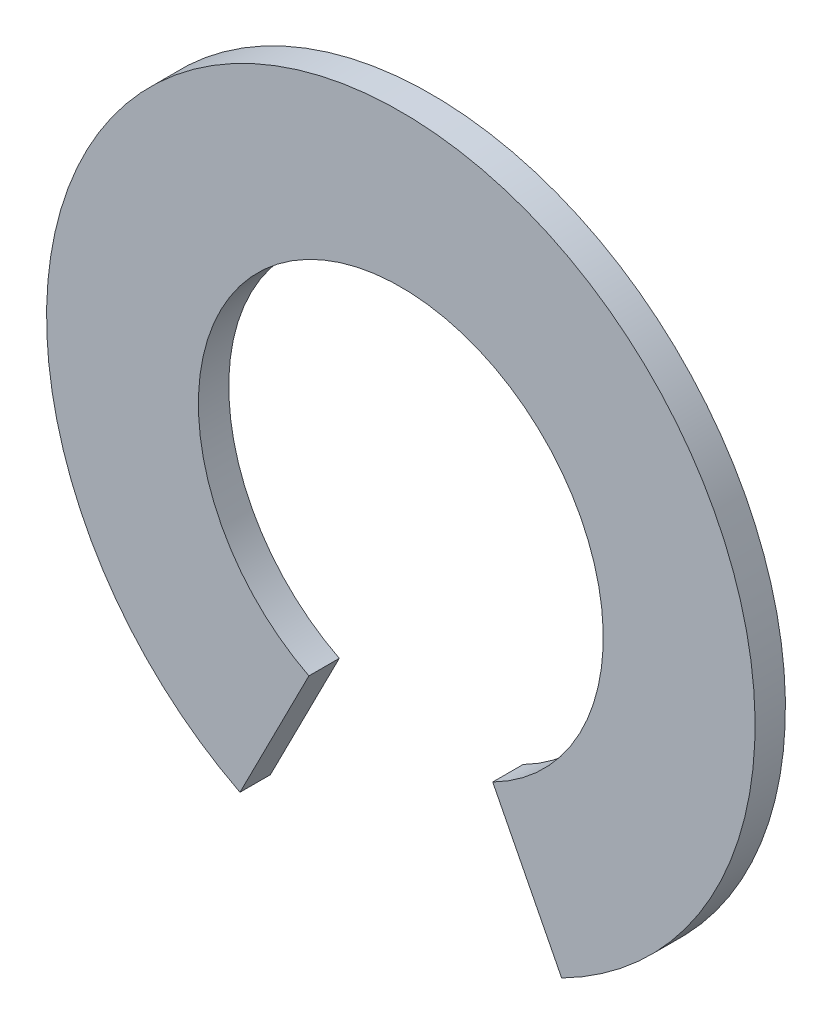
ISO-10303-21;
HEADER;
FILE_DESCRIPTION(('STEP AP214'),'2;1');
FILE_NAME('part.step','',(''),(''),'','','');
FILE_SCHEMA(('AUTOMOTIVE_DESIGN { 1 0 10303 214 1 1 1 1 }'));
ENDSEC;
DATA;
#1=APPLICATION_CONTEXT('core data for automotive mechanical design processes');
#2=APPLICATION_PROTOCOL_DEFINITION('international standard','automotive_design',2000,#1);
#3=PRODUCT_CONTEXT('',#1,'mechanical');
#4=PRODUCT('Part','Part','',(#3));
#5=PRODUCT_RELATED_PRODUCT_CATEGORY('part','',(#4));
#6=PRODUCT_DEFINITION_FORMATION('','',#4);
#7=PRODUCT_DEFINITION_CONTEXT('part definition',#1,'design');
#8=PRODUCT_DEFINITION('design','',#6,#7);
#9=PRODUCT_DEFINITION_SHAPE('','',#8);
#10=(LENGTH_UNIT() NAMED_UNIT(*) SI_UNIT(.MILLI.,.METRE.));
#11=(NAMED_UNIT(*) PLANE_ANGLE_UNIT() SI_UNIT($,.RADIAN.));
#12=(NAMED_UNIT(*) SI_UNIT($,.STERADIAN.) SOLID_ANGLE_UNIT());
#13=UNCERTAINTY_MEASURE_WITH_UNIT(LENGTH_MEASURE(1.E-05),#10,'distance_accuracy_value','');
#14=(GEOMETRIC_REPRESENTATION_CONTEXT(3) GLOBAL_UNCERTAINTY_ASSIGNED_CONTEXT((#13)) GLOBAL_UNIT_ASSIGNED_CONTEXT((#10,
#11,#12)) REPRESENTATION_CONTEXT('',''));
#15=CARTESIAN_POINT('',(0.,0.,0.));
#16=DIRECTION('',(0.,0.,1.));
#17=DIRECTION('',(1.,0.,0.));
#18=AXIS2_PLACEMENT_3D('',#15,#16,#17);
#19=CARTESIAN_POINT('',(0.,0.,1.5));
#20=DIRECTION('',(0.,0.,-1.));
#21=DIRECTION('',(-1.,0.,0.));
#22=AXIS2_PLACEMENT_3D('',#19,#20,#21);
#23=CYLINDRICAL_SURFACE('',#22,10.);
#24=CARTESIAN_POINT('',(0.,0.,0.));
#25=DIRECTION('',(0.,0.,-1.));
#26=DIRECTION('',(1.,0.,0.));
#27=AXIS2_PLACEMENT_3D('',#24,#25,#26);
#28=CIRCLE('',#27,10.);
#29=CARTESIAN_POINT('',(-4.53990499739548,-8.91006524188367,0.));
#30=VERTEX_POINT('',#29);
#31=CARTESIAN_POINT('',(4.53990499739548,-8.91006524188367,0.));
#32=VERTEX_POINT('',#31);
#33=EDGE_CURVE('E98',#30,#32,#28,.T.);
#34=ORIENTED_EDGE('',*,*,#33,.T.);
#35=DIRECTION('',(0.,0.,-1.));
#36=VECTOR('',#35,1.);
#37=CARTESIAN_POINT('',(4.53990499739548,-8.91006524188367,1.5));
#38=LINE('',#37,#36);
#39=CARTESIAN_POINT('',(4.53990499739548,-8.91006524188367,1.5));
#40=VERTEX_POINT('',#39);
#41=EDGE_CURVE('E11',#40,#32,#38,.T.);
#42=ORIENTED_EDGE('',*,*,#41,.F.);
#43=CARTESIAN_POINT('',(0.,0.,1.5));
#44=DIRECTION('',(0.,0.,-1.));
#45=DIRECTION('',(1.,0.,0.));
#46=AXIS2_PLACEMENT_3D('',#43,#44,#45);
#47=CIRCLE('',#46,10.);
#48=CARTESIAN_POINT('',(-4.53990499739548,-8.91006524188367,1.5));
#49=VERTEX_POINT('',#48);
#50=EDGE_CURVE('E86',#49,#40,#47,.T.);
#51=ORIENTED_EDGE('',*,*,#50,.F.);
#52=DIRECTION('',(0.,0.,-1.));
#53=VECTOR('',#52,1.);
#54=CARTESIAN_POINT('',(-4.53990499739548,-8.91006524188367,1.5));
#55=LINE('',#54,#53);
#56=EDGE_CURVE('E94',#49,#30,#55,.T.);
#57=ORIENTED_EDGE('',*,*,#56,.T.);
#58=EDGE_LOOP('',(#34,#42,#51,#57));
#59=FACE_BOUND('',#58,.T.);
#60=ADVANCED_FACE('F35',(#59),#23,.F.);
#61=CARTESIAN_POINT('',(4.53990499739548,-8.91006524188367,1.5));
#62=DIRECTION('',(0.891006524188367,0.453990499739547,0.));
#63=DIRECTION('',(-0.453990499739548,0.891006524188368,0.));
#64=AXIS2_PLACEMENT_3D('',#61,#62,#63);
#65=PLANE('',#64);
#66=DIRECTION('',(0.453990499739548,-0.891006524188368,0.));
#67=VECTOR('',#66,1.);
#68=CARTESIAN_POINT('',(4.53990499739548,-8.91006524188367,0.));
#69=LINE('',#68,#67);
#70=CARTESIAN_POINT('',(7.94483374544208,-15.5926141732964,0.));
#71=VERTEX_POINT('',#70);
#72=EDGE_CURVE('E90',#32,#71,#69,.T.);
#73=ORIENTED_EDGE('',*,*,#72,.T.);
#74=DIRECTION('',(0.,0.,-1.));
#75=VECTOR('',#74,1.);
#76=CARTESIAN_POINT('',(7.94483374544208,-15.5926141732964,1.5));
#77=LINE('',#76,#75);
#78=CARTESIAN_POINT('',(7.94483374544208,-15.5926141732964,1.5));
#79=VERTEX_POINT('',#78);
#80=EDGE_CURVE('E43',#79,#71,#77,.T.);
#81=ORIENTED_EDGE('',*,*,#80,.F.);
#82=DIRECTION('',(0.453990499739548,-0.891006524188368,0.));
#83=VECTOR('',#82,1.);
#84=CARTESIAN_POINT('',(4.53990499739548,-8.91006524188367,1.5));
#85=LINE('',#84,#83);
#86=EDGE_CURVE('E81',#40,#79,#85,.T.);
#87=ORIENTED_EDGE('',*,*,#86,.F.);
#88=ORIENTED_EDGE('',*,*,#41,.T.);
#89=EDGE_LOOP('',(#73,#81,#87,#88));
#90=FACE_BOUND('',#89,.T.);
#91=ADVANCED_FACE('F89',(#90),#65,.F.);
#92=CARTESIAN_POINT('',(0.,0.,1.5));
#93=DIRECTION('',(0.,0.,-1.));
#94=DIRECTION('',(-1.,0.,0.));
#95=AXIS2_PLACEMENT_3D('',#92,#93,#94);
#96=CYLINDRICAL_SURFACE('',#95,17.5);
#97=CARTESIAN_POINT('',(0.,0.,0.));
#98=DIRECTION('',(0.,0.,1.));
#99=DIRECTION('',(1.,0.,0.));
#100=AXIS2_PLACEMENT_3D('',#97,#98,#99);
#101=CIRCLE('',#100,17.5);
#102=CARTESIAN_POINT('',(-7.94483374544208,-15.5926141732964,0.));
#103=VERTEX_POINT('',#102);
#104=EDGE_CURVE('E68',#71,#103,#101,.T.);
#105=ORIENTED_EDGE('',*,*,#104,.T.);
#106=DIRECTION('',(0.,0.,-1.));
#107=VECTOR('',#106,1.);
#108=CARTESIAN_POINT('',(-7.94483374544208,-15.5926141732964,1.5));
#109=LINE('',#108,#107);
#110=CARTESIAN_POINT('',(-7.94483374544208,-15.5926141732964,1.5));
#111=VERTEX_POINT('',#110);
#112=EDGE_CURVE('E91',#111,#103,#109,.T.);
#113=ORIENTED_EDGE('',*,*,#112,.F.);
#114=CARTESIAN_POINT('',(0.,0.,1.5));
#115=DIRECTION('',(0.,0.,1.));
#116=DIRECTION('',(1.,0.,0.));
#117=AXIS2_PLACEMENT_3D('',#114,#115,#116);
#118=CIRCLE('',#117,17.5);
#119=EDGE_CURVE('E84',#79,#111,#118,.T.);
#120=ORIENTED_EDGE('',*,*,#119,.F.);
#121=ORIENTED_EDGE('',*,*,#80,.T.);
#122=EDGE_LOOP('',(#105,#113,#120,#121));
#123=FACE_BOUND('',#122,.T.);
#124=ADVANCED_FACE('F92',(#123),#96,.T.);
#125=CARTESIAN_POINT('',(-4.53990499739548,-8.91006524188367,1.5));
#126=DIRECTION('',(-0.891006524188367,0.453990499739548,0.));
#127=DIRECTION('',(-0.453990499739548,-0.891006524188367,0.));
#128=AXIS2_PLACEMENT_3D('',#125,#126,#127);
#129=PLANE('',#128);
#130=DIRECTION('',(0.453990499739548,0.891006524188367,0.));
#131=VECTOR('',#130,1.);
#132=CARTESIAN_POINT('',(-4.53990499739548,-8.91006524188367,0.));
#133=LINE('',#132,#131);
#134=EDGE_CURVE('E74',#103,#30,#133,.T.);
#135=ORIENTED_EDGE('',*,*,#134,.T.);
#136=ORIENTED_EDGE('',*,*,#56,.F.);
#137=DIRECTION('',(0.453990499739548,0.891006524188367,0.));
#138=VECTOR('',#137,1.);
#139=CARTESIAN_POINT('',(-4.53990499739548,-8.91006524188367,1.5));
#140=LINE('',#139,#138);
#141=EDGE_CURVE('E51',#111,#49,#140,.T.);
#142=ORIENTED_EDGE('',*,*,#141,.F.);
#143=ORIENTED_EDGE('',*,*,#112,.T.);
#144=EDGE_LOOP('',(#135,#136,#142,#143));
#145=FACE_BOUND('',#144,.T.);
#146=ADVANCED_FACE('F105',(#145),#129,.F.);
#147=CARTESIAN_POINT('',(0.,0.,1.5));
#148=DIRECTION('',(0.,0.,1.));
#149=DIRECTION('',(1.,0.,0.));
#150=AXIS2_PLACEMENT_3D('',#147,#148,#149);
#151=PLANE('',#150);
#152=ORIENTED_EDGE('',*,*,#50,.T.);
#153=ORIENTED_EDGE('',*,*,#86,.T.);
#154=ORIENTED_EDGE('',*,*,#119,.T.);
#155=ORIENTED_EDGE('',*,*,#141,.T.);
#156=EDGE_LOOP('',(#152,#153,#154,#155));
#157=FACE_BOUND('',#156,.T.);
#158=ADVANCED_FACE('F82',(#157),#151,.T.);
#159=CARTESIAN_POINT('',(0.,0.,0.));
#160=DIRECTION('',(0.,0.,1.));
#161=DIRECTION('',(1.,0.,0.));
#162=AXIS2_PLACEMENT_3D('',#159,#160,#161);
#163=PLANE('',#162);
#164=ORIENTED_EDGE('',*,*,#33,.F.);
#165=ORIENTED_EDGE('',*,*,#134,.F.);
#166=ORIENTED_EDGE('',*,*,#104,.F.);
#167=ORIENTED_EDGE('',*,*,#72,.F.);
#168=EDGE_LOOP('',(#164,#165,#166,#167));
#169=FACE_BOUND('',#168,.T.);
#170=ADVANCED_FACE('F108',(#169),#163,.F.);
#171=CLOSED_SHELL('',(#60,#91,#124,#146,#158,#170));
#172=MANIFOLD_SOLID_BREP('B2',#171);
#173=ADVANCED_BREP_SHAPE_REPRESENTATION('',(#18,#172),#14);
#174=SHAPE_DEFINITION_REPRESENTATION(#9,#173);
ENDSEC;
END-ISO-10303-21;
